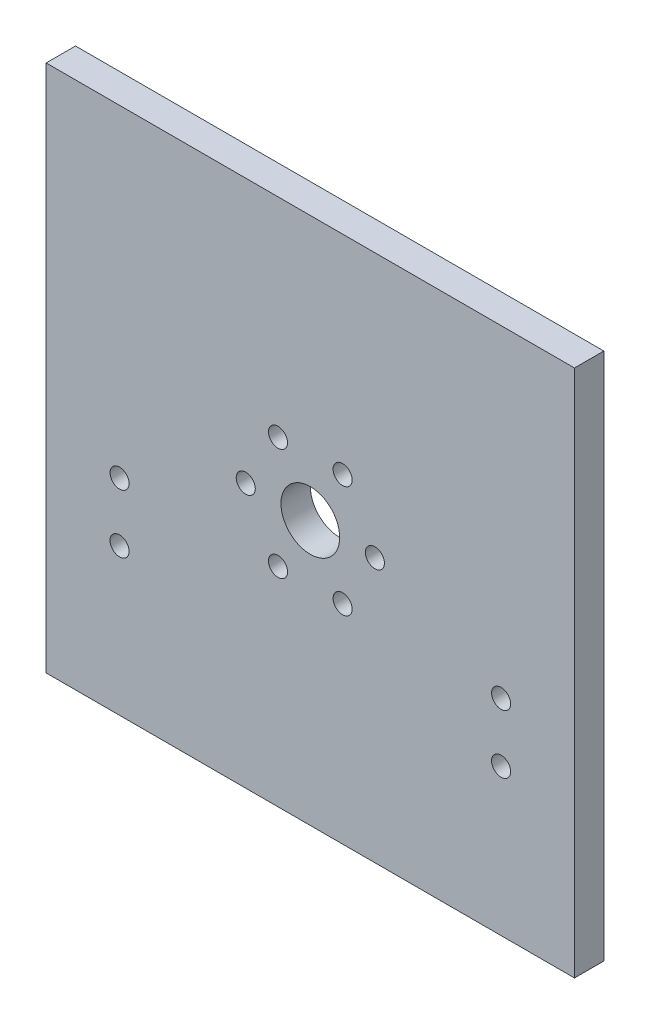
ISO-10303-21;
HEADER;
FILE_DESCRIPTION(('STEP AP214'),'2;1');
FILE_NAME('part.step','',(''),(''),'','','');
FILE_SCHEMA(('AUTOMOTIVE_DESIGN { 1 0 10303 214 1 1 1 1 }'));
ENDSEC;
DATA;
#1=APPLICATION_CONTEXT('core data for automotive mechanical design processes');
#2=APPLICATION_PROTOCOL_DEFINITION('international standard','automotive_design',2000,#1);
#3=PRODUCT_CONTEXT('',#1,'mechanical');
#4=PRODUCT('Part','Part','',(#3));
#5=PRODUCT_RELATED_PRODUCT_CATEGORY('part','',(#4));
#6=PRODUCT_DEFINITION_FORMATION('','',#4);
#7=PRODUCT_DEFINITION_CONTEXT('part definition',#1,'design');
#8=PRODUCT_DEFINITION('design','',#6,#7);
#9=PRODUCT_DEFINITION_SHAPE('','',#8);
#10=(LENGTH_UNIT() NAMED_UNIT(*) SI_UNIT(.MILLI.,.METRE.));
#11=(NAMED_UNIT(*) PLANE_ANGLE_UNIT() SI_UNIT($,.RADIAN.));
#12=(NAMED_UNIT(*) SI_UNIT($,.STERADIAN.) SOLID_ANGLE_UNIT());
#13=UNCERTAINTY_MEASURE_WITH_UNIT(LENGTH_MEASURE(1.E-05),#10,'distance_accuracy_value','');
#14=(GEOMETRIC_REPRESENTATION_CONTEXT(3) GLOBAL_UNCERTAINTY_ASSIGNED_CONTEXT((#13)) GLOBAL_UNIT_ASSIGNED_CONTEXT((#10,
#11,#12)) REPRESENTATION_CONTEXT('',''));
#15=CARTESIAN_POINT('',(0.,0.,0.));
#16=DIRECTION('',(0.,0.,1.));
#17=DIRECTION('',(1.,0.,0.));
#18=AXIS2_PLACEMENT_3D('',#15,#16,#17);
#19=CARTESIAN_POINT('',(-90.,90.,10.));
#20=DIRECTION('',(1.,0.,0.));
#21=DIRECTION('',(0.,0.,-1.));
#22=AXIS2_PLACEMENT_3D('',#19,#20,#21);
#23=PLANE('',#22);
#24=DIRECTION('',(0.,-1.,0.));
#25=VECTOR('',#24,1.);
#26=CARTESIAN_POINT('',(-90.,90.,0.));
#27=LINE('',#26,#25);
#28=CARTESIAN_POINT('',(-90.,90.,0.));
#29=VERTEX_POINT('',#28);
#30=CARTESIAN_POINT('',(-90.,-90.,0.));
#31=VERTEX_POINT('',#30);
#32=EDGE_CURVE('E115',#29,#31,#27,.T.);
#33=ORIENTED_EDGE('',*,*,#32,.T.);
#34=DIRECTION('',(0.,0.,-1.));
#35=VECTOR('',#34,1.);
#36=CARTESIAN_POINT('',(-90.,-90.,10.));
#37=LINE('',#36,#35);
#38=CARTESIAN_POINT('',(-90.,-90.,10.));
#39=VERTEX_POINT('',#38);
#40=EDGE_CURVE('E11',#39,#31,#37,.T.);
#41=ORIENTED_EDGE('',*,*,#40,.F.);
#42=DIRECTION('',(0.,-1.,0.));
#43=VECTOR('',#42,1.);
#44=CARTESIAN_POINT('',(-90.,90.,10.));
#45=LINE('',#44,#43);
#46=CARTESIAN_POINT('',(-90.,90.,10.));
#47=VERTEX_POINT('',#46);
#48=EDGE_CURVE('E99',#47,#39,#45,.T.);
#49=ORIENTED_EDGE('',*,*,#48,.F.);
#50=DIRECTION('',(0.,0.,-1.));
#51=VECTOR('',#50,1.);
#52=CARTESIAN_POINT('',(-90.,90.,10.));
#53=LINE('',#52,#51);
#54=EDGE_CURVE('E111',#47,#29,#53,.T.);
#55=ORIENTED_EDGE('',*,*,#54,.T.);
#56=EDGE_LOOP('',(#33,#41,#49,#55));
#57=FACE_BOUND('',#56,.T.);
#58=ADVANCED_FACE('F47',(#57),#23,.F.);
#59=CARTESIAN_POINT('',(-90.,-90.,10.));
#60=DIRECTION('',(0.,1.,0.));
#61=DIRECTION('',(0.,0.,1.));
#62=AXIS2_PLACEMENT_3D('',#59,#60,#61);
#63=PLANE('',#62);
#64=DIRECTION('',(1.,0.,0.));
#65=VECTOR('',#64,1.);
#66=CARTESIAN_POINT('',(-90.,-90.,0.));
#67=LINE('',#66,#65);
#68=CARTESIAN_POINT('',(90.,-90.,0.));
#69=VERTEX_POINT('',#68);
#70=EDGE_CURVE('E104',#31,#69,#67,.T.);
#71=ORIENTED_EDGE('',*,*,#70,.T.);
#72=DIRECTION('',(0.,0.,-1.));
#73=VECTOR('',#72,1.);
#74=CARTESIAN_POINT('',(90.,-90.,10.));
#75=LINE('',#74,#73);
#76=CARTESIAN_POINT('',(90.,-90.,10.));
#77=VERTEX_POINT('',#76);
#78=EDGE_CURVE('E56',#77,#69,#75,.T.);
#79=ORIENTED_EDGE('',*,*,#78,.F.);
#80=DIRECTION('',(1.,0.,0.));
#81=VECTOR('',#80,1.);
#82=CARTESIAN_POINT('',(-90.,-90.,10.));
#83=LINE('',#82,#81);
#84=EDGE_CURVE('E94',#39,#77,#83,.T.);
#85=ORIENTED_EDGE('',*,*,#84,.F.);
#86=ORIENTED_EDGE('',*,*,#40,.T.);
#87=EDGE_LOOP('',(#71,#79,#85,#86));
#88=FACE_BOUND('',#87,.T.);
#89=ADVANCED_FACE('F103',(#88),#63,.F.);
#90=CARTESIAN_POINT('',(90.,-90.,10.));
#91=DIRECTION('',(-1.,0.,0.));
#92=DIRECTION('',(0.,0.,1.));
#93=AXIS2_PLACEMENT_3D('',#90,#91,#92);
#94=PLANE('',#93);
#95=DIRECTION('',(0.,1.,0.));
#96=VECTOR('',#95,1.);
#97=CARTESIAN_POINT('',(90.,-90.,0.));
#98=LINE('',#97,#96);
#99=CARTESIAN_POINT('',(90.,90.,0.));
#100=VERTEX_POINT('',#99);
#101=EDGE_CURVE('E81',#69,#100,#98,.T.);
#102=ORIENTED_EDGE('',*,*,#101,.T.);
#103=DIRECTION('',(0.,0.,-1.));
#104=VECTOR('',#103,1.);
#105=CARTESIAN_POINT('',(90.,90.,10.));
#106=LINE('',#105,#104);
#107=CARTESIAN_POINT('',(90.,90.,10.));
#108=VERTEX_POINT('',#107);
#109=EDGE_CURVE('E106',#108,#100,#106,.T.);
#110=ORIENTED_EDGE('',*,*,#109,.F.);
#111=DIRECTION('',(0.,1.,0.));
#112=VECTOR('',#111,1.);
#113=CARTESIAN_POINT('',(90.,-90.,10.));
#114=LINE('',#113,#112);
#115=EDGE_CURVE('E97',#77,#108,#114,.T.);
#116=ORIENTED_EDGE('',*,*,#115,.F.);
#117=ORIENTED_EDGE('',*,*,#78,.T.);
#118=EDGE_LOOP('',(#102,#110,#116,#117));
#119=FACE_BOUND('',#118,.T.);
#120=ADVANCED_FACE('F107',(#119),#94,.F.);
#121=CARTESIAN_POINT('',(90.,90.,10.));
#122=DIRECTION('',(0.,-1.,0.));
#123=DIRECTION('',(0.,0.,-1.));
#124=AXIS2_PLACEMENT_3D('',#121,#122,#123);
#125=PLANE('',#124);
#126=DIRECTION('',(-1.,0.,0.));
#127=VECTOR('',#126,1.);
#128=CARTESIAN_POINT('',(90.,90.,0.));
#129=LINE('',#128,#127);
#130=EDGE_CURVE('E87',#100,#29,#129,.T.);
#131=ORIENTED_EDGE('',*,*,#130,.T.);
#132=ORIENTED_EDGE('',*,*,#54,.F.);
#133=DIRECTION('',(-1.,0.,0.));
#134=VECTOR('',#133,1.);
#135=CARTESIAN_POINT('',(90.,90.,10.));
#136=LINE('',#135,#134);
#137=EDGE_CURVE('E64',#108,#47,#136,.T.);
#138=ORIENTED_EDGE('',*,*,#137,.F.);
#139=ORIENTED_EDGE('',*,*,#109,.T.);
#140=EDGE_LOOP('',(#131,#132,#138,#139));
#141=FACE_BOUND('',#140,.T.);
#142=ADVANCED_FACE('F129',(#141),#125,.F.);
#143=CARTESIAN_POINT('',(0.,0.,10.));
#144=DIRECTION('',(0.,0.,1.));
#145=DIRECTION('',(1.,0.,0.));
#146=AXIS2_PLACEMENT_3D('',#143,#144,#145);
#147=PLANE('',#146);
#148=CARTESIAN_POINT('',(65.,-40.,10.));
#149=DIRECTION('',(0.,0.,1.));
#150=DIRECTION('',(1.,0.,0.));
#151=AXIS2_PLACEMENT_3D('',#148,#149,#150);
#152=CIRCLE('',#151,3.25);
#153=CARTESIAN_POINT('',(68.25,-40.,10.));
#154=VERTEX_POINT('',#153);
#155=EDGE_CURVE('E119',#154,#154,#152,.T.);
#156=ORIENTED_EDGE('',*,*,#155,.F.);
#157=EDGE_LOOP('',(#156));
#158=FACE_BOUND('',#157,.T.);
#159=CARTESIAN_POINT('',(65.,-20.,10.));
#160=DIRECTION('',(0.,0.,1.));
#161=DIRECTION('',(1.,0.,0.));
#162=AXIS2_PLACEMENT_3D('',#159,#160,#161);
#163=CIRCLE('',#162,3.25);
#164=CARTESIAN_POINT('',(68.25,-20.,10.));
#165=VERTEX_POINT('',#164);
#166=EDGE_CURVE('E139',#165,#165,#163,.T.);
#167=ORIENTED_EDGE('',*,*,#166,.F.);
#168=EDGE_LOOP('',(#167));
#169=FACE_BOUND('',#168,.T.);
#170=CARTESIAN_POINT('',(-65.,-40.,10.));
#171=DIRECTION('',(0.,0.,1.));
#172=DIRECTION('',(1.,0.,0.));
#173=AXIS2_PLACEMENT_3D('',#170,#171,#172);
#174=CIRCLE('',#173,3.25);
#175=CARTESIAN_POINT('',(-61.75,-40.,10.));
#176=VERTEX_POINT('',#175);
#177=EDGE_CURVE('E143',#176,#176,#174,.T.);
#178=ORIENTED_EDGE('',*,*,#177,.F.);
#179=EDGE_LOOP('',(#178));
#180=FACE_BOUND('',#179,.T.);
#181=CARTESIAN_POINT('',(-65.,-20.,10.));
#182=DIRECTION('',(0.,0.,1.));
#183=DIRECTION('',(1.,0.,0.));
#184=AXIS2_PLACEMENT_3D('',#181,#182,#183);
#185=CIRCLE('',#184,3.25);
#186=CARTESIAN_POINT('',(-61.75,-20.,10.));
#187=VERTEX_POINT('',#186);
#188=EDGE_CURVE('E147',#187,#187,#185,.T.);
#189=ORIENTED_EDGE('',*,*,#188,.F.);
#190=EDGE_LOOP('',(#189));
#191=FACE_BOUND('',#190,.T.);
#192=CARTESIAN_POINT('',(11.,-19.0525588832576,10.));
#193=DIRECTION('',(0.,0.,1.));
#194=DIRECTION('',(1.,0.,0.));
#195=AXIS2_PLACEMENT_3D('',#192,#193,#194);
#196=CIRCLE('',#195,3.25);
#197=CARTESIAN_POINT('',(14.25,-19.0525588832576,10.));
#198=VERTEX_POINT('',#197);
#199=EDGE_CURVE('E151',#198,#198,#196,.T.);
#200=ORIENTED_EDGE('',*,*,#199,.F.);
#201=EDGE_LOOP('',(#200));
#202=FACE_BOUND('',#201,.T.);
#203=CARTESIAN_POINT('',(-11.,-19.0525588832576,10.));
#204=DIRECTION('',(0.,0.,1.));
#205=DIRECTION('',(1.,0.,0.));
#206=AXIS2_PLACEMENT_3D('',#203,#204,#205);
#207=CIRCLE('',#206,3.25);
#208=CARTESIAN_POINT('',(-7.75000000000001,-19.0525588832576,10.));
#209=VERTEX_POINT('',#208);
#210=EDGE_CURVE('E155',#209,#209,#207,.T.);
#211=ORIENTED_EDGE('',*,*,#210,.F.);
#212=EDGE_LOOP('',(#211));
#213=FACE_BOUND('',#212,.T.);
#214=CARTESIAN_POINT('',(-22.,0.,10.));
#215=DIRECTION('',(0.,0.,1.));
#216=DIRECTION('',(1.,0.,0.));
#217=AXIS2_PLACEMENT_3D('',#214,#215,#216);
#218=CIRCLE('',#217,3.25);
#219=CARTESIAN_POINT('',(-18.75,0.,10.));
#220=VERTEX_POINT('',#219);
#221=EDGE_CURVE('E159',#220,#220,#218,.T.);
#222=ORIENTED_EDGE('',*,*,#221,.F.);
#223=EDGE_LOOP('',(#222));
#224=FACE_BOUND('',#223,.T.);
#225=CARTESIAN_POINT('',(-11.,19.0525588832577,10.));
#226=DIRECTION('',(0.,0.,1.));
#227=DIRECTION('',(1.,0.,0.));
#228=AXIS2_PLACEMENT_3D('',#225,#226,#227);
#229=CIRCLE('',#228,3.25);
#230=CARTESIAN_POINT('',(-7.74999999999999,19.0525588832577,10.));
#231=VERTEX_POINT('',#230);
#232=EDGE_CURVE('E163',#231,#231,#229,.T.);
#233=ORIENTED_EDGE('',*,*,#232,.F.);
#234=EDGE_LOOP('',(#233));
#235=FACE_BOUND('',#234,.T.);
#236=CARTESIAN_POINT('',(11.,19.0525588832576,10.));
#237=DIRECTION('',(0.,0.,1.));
#238=DIRECTION('',(1.,0.,0.));
#239=AXIS2_PLACEMENT_3D('',#236,#237,#238);
#240=CIRCLE('',#239,3.25);
#241=CARTESIAN_POINT('',(14.25,19.0525588832576,10.));
#242=VERTEX_POINT('',#241);
#243=EDGE_CURVE('E167',#242,#242,#240,.T.);
#244=ORIENTED_EDGE('',*,*,#243,.F.);
#245=EDGE_LOOP('',(#244));
#246=FACE_BOUND('',#245,.T.);
#247=CARTESIAN_POINT('',(22.,0.,10.));
#248=DIRECTION('',(0.,0.,1.));
#249=DIRECTION('',(1.,0.,0.));
#250=AXIS2_PLACEMENT_3D('',#247,#248,#249);
#251=CIRCLE('',#250,3.25);
#252=CARTESIAN_POINT('',(25.25,0.,10.));
#253=VERTEX_POINT('',#252);
#254=EDGE_CURVE('E171',#253,#253,#251,.T.);
#255=ORIENTED_EDGE('',*,*,#254,.F.);
#256=EDGE_LOOP('',(#255));
#257=FACE_BOUND('',#256,.T.);
#258=CARTESIAN_POINT('',(0.,0.,10.));
#259=DIRECTION('',(0.,0.,1.));
#260=DIRECTION('',(1.,0.,0.));
#261=AXIS2_PLACEMENT_3D('',#258,#259,#260);
#262=CIRCLE('',#261,10.);
#263=CARTESIAN_POINT('',(10.,0.,10.));
#264=VERTEX_POINT('',#263);
#265=EDGE_CURVE('E175',#264,#264,#262,.T.);
#266=ORIENTED_EDGE('',*,*,#265,.F.);
#267=EDGE_LOOP('',(#266));
#268=FACE_BOUND('',#267,.T.);
#269=ORIENTED_EDGE('',*,*,#48,.T.);
#270=ORIENTED_EDGE('',*,*,#84,.T.);
#271=ORIENTED_EDGE('',*,*,#115,.T.);
#272=ORIENTED_EDGE('',*,*,#137,.T.);
#273=EDGE_LOOP('',(#269,#270,#271,#272));
#274=FACE_BOUND('',#273,.T.);
#275=ADVANCED_FACE('F95',(#158,#169,#180,#191,#202,#213,#224,#235,#246,#257,#268,#274),#147,.T.);
#276=CARTESIAN_POINT('',(0.,0.,0.));
#277=DIRECTION('',(0.,0.,1.));
#278=DIRECTION('',(1.,0.,0.));
#279=AXIS2_PLACEMENT_3D('',#276,#277,#278);
#280=PLANE('',#279);
#281=CARTESIAN_POINT('',(65.,-40.,0.));
#282=DIRECTION('',(0.,0.,-1.));
#283=DIRECTION('',(-1.,0.,0.));
#284=AXIS2_PLACEMENT_3D('',#281,#282,#283);
#285=CIRCLE('',#284,3.25);
#286=CARTESIAN_POINT('',(61.75,-40.,0.));
#287=VERTEX_POINT('',#286);
#288=EDGE_CURVE('E184',#287,#287,#285,.T.);
#289=ORIENTED_EDGE('',*,*,#288,.F.);
#290=EDGE_LOOP('',(#289));
#291=FACE_BOUND('',#290,.T.);
#292=CARTESIAN_POINT('',(65.,-20.,0.));
#293=DIRECTION('',(0.,0.,-1.));
#294=DIRECTION('',(-1.,0.,0.));
#295=AXIS2_PLACEMENT_3D('',#292,#293,#294);
#296=CIRCLE('',#295,3.25);
#297=CARTESIAN_POINT('',(61.75,-20.,0.));
#298=VERTEX_POINT('',#297);
#299=EDGE_CURVE('E188',#298,#298,#296,.T.);
#300=ORIENTED_EDGE('',*,*,#299,.F.);
#301=EDGE_LOOP('',(#300));
#302=FACE_BOUND('',#301,.T.);
#303=CARTESIAN_POINT('',(-65.,-40.,0.));
#304=DIRECTION('',(0.,0.,-1.));
#305=DIRECTION('',(-1.,0.,0.));
#306=AXIS2_PLACEMENT_3D('',#303,#304,#305);
#307=CIRCLE('',#306,3.25);
#308=CARTESIAN_POINT('',(-68.25,-40.,0.));
#309=VERTEX_POINT('',#308);
#310=EDGE_CURVE('E192',#309,#309,#307,.T.);
#311=ORIENTED_EDGE('',*,*,#310,.F.);
#312=EDGE_LOOP('',(#311));
#313=FACE_BOUND('',#312,.T.);
#314=CARTESIAN_POINT('',(-65.,-20.,0.));
#315=DIRECTION('',(0.,0.,-1.));
#316=DIRECTION('',(-1.,0.,0.));
#317=AXIS2_PLACEMENT_3D('',#314,#315,#316);
#318=CIRCLE('',#317,3.25);
#319=CARTESIAN_POINT('',(-68.25,-20.,0.));
#320=VERTEX_POINT('',#319);
#321=EDGE_CURVE('E196',#320,#320,#318,.T.);
#322=ORIENTED_EDGE('',*,*,#321,.F.);
#323=EDGE_LOOP('',(#322));
#324=FACE_BOUND('',#323,.T.);
#325=CARTESIAN_POINT('',(11.,-19.0525588832576,0.));
#326=DIRECTION('',(0.,0.,-1.));
#327=DIRECTION('',(-1.,0.,0.));
#328=AXIS2_PLACEMENT_3D('',#325,#326,#327);
#329=CIRCLE('',#328,3.25);
#330=CARTESIAN_POINT('',(7.75,-19.0525588832576,0.));
#331=VERTEX_POINT('',#330);
#332=EDGE_CURVE('E200',#331,#331,#329,.T.);
#333=ORIENTED_EDGE('',*,*,#332,.F.);
#334=EDGE_LOOP('',(#333));
#335=FACE_BOUND('',#334,.T.);
#336=CARTESIAN_POINT('',(-11.,-19.0525588832576,0.));
#337=DIRECTION('',(0.,0.,-1.));
#338=DIRECTION('',(-1.,0.,0.));
#339=AXIS2_PLACEMENT_3D('',#336,#337,#338);
#340=CIRCLE('',#339,3.25);
#341=CARTESIAN_POINT('',(-14.25,-19.0525588832576,0.));
#342=VERTEX_POINT('',#341);
#343=EDGE_CURVE('E204',#342,#342,#340,.T.);
#344=ORIENTED_EDGE('',*,*,#343,.F.);
#345=EDGE_LOOP('',(#344));
#346=FACE_BOUND('',#345,.T.);
#347=CARTESIAN_POINT('',(-22.,0.,0.));
#348=DIRECTION('',(0.,0.,-1.));
#349=DIRECTION('',(-1.,0.,0.));
#350=AXIS2_PLACEMENT_3D('',#347,#348,#349);
#351=CIRCLE('',#350,3.25);
#352=CARTESIAN_POINT('',(-25.25,0.,0.));
#353=VERTEX_POINT('',#352);
#354=EDGE_CURVE('E208',#353,#353,#351,.T.);
#355=ORIENTED_EDGE('',*,*,#354,.F.);
#356=EDGE_LOOP('',(#355));
#357=FACE_BOUND('',#356,.T.);
#358=CARTESIAN_POINT('',(-11.,19.0525588832577,0.));
#359=DIRECTION('',(0.,0.,-1.));
#360=DIRECTION('',(-1.,0.,0.));
#361=AXIS2_PLACEMENT_3D('',#358,#359,#360);
#362=CIRCLE('',#361,3.25);
#363=CARTESIAN_POINT('',(-14.25,19.0525588832577,0.));
#364=VERTEX_POINT('',#363);
#365=EDGE_CURVE('E212',#364,#364,#362,.T.);
#366=ORIENTED_EDGE('',*,*,#365,.F.);
#367=EDGE_LOOP('',(#366));
#368=FACE_BOUND('',#367,.T.);
#369=CARTESIAN_POINT('',(11.,19.0525588832576,0.));
#370=DIRECTION('',(0.,0.,-1.));
#371=DIRECTION('',(-1.,0.,0.));
#372=AXIS2_PLACEMENT_3D('',#369,#370,#371);
#373=CIRCLE('',#372,3.25);
#374=CARTESIAN_POINT('',(7.75,19.0525588832576,0.));
#375=VERTEX_POINT('',#374);
#376=EDGE_CURVE('E216',#375,#375,#373,.T.);
#377=ORIENTED_EDGE('',*,*,#376,.F.);
#378=EDGE_LOOP('',(#377));
#379=FACE_BOUND('',#378,.T.);
#380=CARTESIAN_POINT('',(22.,0.,0.));
#381=DIRECTION('',(0.,0.,-1.));
#382=DIRECTION('',(-1.,0.,0.));
#383=AXIS2_PLACEMENT_3D('',#380,#381,#382);
#384=CIRCLE('',#383,3.25);
#385=CARTESIAN_POINT('',(18.75,0.,0.));
#386=VERTEX_POINT('',#385);
#387=EDGE_CURVE('E183',#386,#386,#384,.T.);
#388=ORIENTED_EDGE('',*,*,#387,.F.);
#389=EDGE_LOOP('',(#388));
#390=FACE_BOUND('',#389,.T.);
#391=CARTESIAN_POINT('',(0.,0.,0.));
#392=DIRECTION('',(0.,0.,-1.));
#393=DIRECTION('',(-1.,0.,0.));
#394=AXIS2_PLACEMENT_3D('',#391,#392,#393);
#395=CIRCLE('',#394,10.);
#396=CARTESIAN_POINT('',(-10.,0.,0.));
#397=VERTEX_POINT('',#396);
#398=EDGE_CURVE('E179',#397,#397,#395,.T.);
#399=ORIENTED_EDGE('',*,*,#398,.F.);
#400=EDGE_LOOP('',(#399));
#401=FACE_BOUND('',#400,.T.);
#402=ORIENTED_EDGE('',*,*,#32,.F.);
#403=ORIENTED_EDGE('',*,*,#130,.F.);
#404=ORIENTED_EDGE('',*,*,#101,.F.);
#405=ORIENTED_EDGE('',*,*,#70,.F.);
#406=EDGE_LOOP('',(#402,#403,#404,#405));
#407=FACE_BOUND('',#406,.T.);
#408=ADVANCED_FACE('F132',(#291,#302,#313,#324,#335,#346,#357,#368,#379,#390,#401,#407),#280,.F.);
#409=CARTESIAN_POINT('',(0.,0.,11.));
#410=DIRECTION('',(0.,0.,-1.));
#411=DIRECTION('',(-1.,0.,0.));
#412=AXIS2_PLACEMENT_3D('',#409,#410,#411);
#413=CYLINDRICAL_SURFACE('',#412,10.);
#414=ORIENTED_EDGE('',*,*,#265,.T.);
#415=EDGE_LOOP('',(#414));
#416=FACE_BOUND('',#415,.T.);
#417=ORIENTED_EDGE('',*,*,#398,.T.);
#418=EDGE_LOOP('',(#417));
#419=FACE_BOUND('',#418,.T.);
#420=ADVANCED_FACE('F228',(#416,#419),#413,.F.);
#421=CARTESIAN_POINT('',(22.,0.,11.));
#422=DIRECTION('',(0.,0.,-1.));
#423=DIRECTION('',(-1.,0.,0.));
#424=AXIS2_PLACEMENT_3D('',#421,#422,#423);
#425=CYLINDRICAL_SURFACE('',#424,3.25);
#426=ORIENTED_EDGE('',*,*,#254,.T.);
#427=EDGE_LOOP('',(#426));
#428=FACE_BOUND('',#427,.T.);
#429=ORIENTED_EDGE('',*,*,#387,.T.);
#430=EDGE_LOOP('',(#429));
#431=FACE_BOUND('',#430,.T.);
#432=ADVANCED_FACE('F224',(#428,#431),#425,.F.);
#433=CARTESIAN_POINT('',(11.,19.0525588832576,11.));
#434=DIRECTION('',(0.,0.,-1.));
#435=DIRECTION('',(-1.,0.,0.));
#436=AXIS2_PLACEMENT_3D('',#433,#434,#435);
#437=CYLINDRICAL_SURFACE('',#436,3.25);
#438=ORIENTED_EDGE('',*,*,#243,.T.);
#439=EDGE_LOOP('',(#438));
#440=FACE_BOUND('',#439,.T.);
#441=ORIENTED_EDGE('',*,*,#376,.T.);
#442=EDGE_LOOP('',(#441));
#443=FACE_BOUND('',#442,.T.);
#444=ADVANCED_FACE('F239',(#440,#443),#437,.F.);
#445=CARTESIAN_POINT('',(-11.,19.0525588832577,11.));
#446=DIRECTION('',(0.,0.,-1.));
#447=DIRECTION('',(-1.,0.,0.));
#448=AXIS2_PLACEMENT_3D('',#445,#446,#447);
#449=CYLINDRICAL_SURFACE('',#448,3.25);
#450=ORIENTED_EDGE('',*,*,#232,.T.);
#451=EDGE_LOOP('',(#450));
#452=FACE_BOUND('',#451,.T.);
#453=ORIENTED_EDGE('',*,*,#365,.T.);
#454=EDGE_LOOP('',(#453));
#455=FACE_BOUND('',#454,.T.);
#456=ADVANCED_FACE('F282',(#452,#455),#449,.F.);
#457=CARTESIAN_POINT('',(-22.,0.,11.));
#458=DIRECTION('',(0.,0.,-1.));
#459=DIRECTION('',(-1.,0.,0.));
#460=AXIS2_PLACEMENT_3D('',#457,#458,#459);
#461=CYLINDRICAL_SURFACE('',#460,3.25);
#462=ORIENTED_EDGE('',*,*,#221,.T.);
#463=EDGE_LOOP('',(#462));
#464=FACE_BOUND('',#463,.T.);
#465=ORIENTED_EDGE('',*,*,#354,.T.);
#466=EDGE_LOOP('',(#465));
#467=FACE_BOUND('',#466,.T.);
#468=ADVANCED_FACE('F289',(#464,#467),#461,.F.);
#469=CARTESIAN_POINT('',(-11.,-19.0525588832576,11.));
#470=DIRECTION('',(0.,0.,-1.));
#471=DIRECTION('',(-1.,0.,0.));
#472=AXIS2_PLACEMENT_3D('',#469,#470,#471);
#473=CYLINDRICAL_SURFACE('',#472,3.25);
#474=ORIENTED_EDGE('',*,*,#210,.T.);
#475=EDGE_LOOP('',(#474));
#476=FACE_BOUND('',#475,.T.);
#477=ORIENTED_EDGE('',*,*,#343,.T.);
#478=EDGE_LOOP('',(#477));
#479=FACE_BOUND('',#478,.T.);
#480=ADVANCED_FACE('F295',(#476,#479),#473,.F.);
#481=CARTESIAN_POINT('',(11.,-19.0525588832576,11.));
#482=DIRECTION('',(0.,0.,-1.));
#483=DIRECTION('',(-1.,0.,0.));
#484=AXIS2_PLACEMENT_3D('',#481,#482,#483);
#485=CYLINDRICAL_SURFACE('',#484,3.25);
#486=ORIENTED_EDGE('',*,*,#199,.T.);
#487=EDGE_LOOP('',(#486));
#488=FACE_BOUND('',#487,.T.);
#489=ORIENTED_EDGE('',*,*,#332,.T.);
#490=EDGE_LOOP('',(#489));
#491=FACE_BOUND('',#490,.T.);
#492=ADVANCED_FACE('F299',(#488,#491),#485,.F.);
#493=CARTESIAN_POINT('',(-65.,-20.,11.));
#494=DIRECTION('',(0.,0.,-1.));
#495=DIRECTION('',(-1.,0.,0.));
#496=AXIS2_PLACEMENT_3D('',#493,#494,#495);
#497=CYLINDRICAL_SURFACE('',#496,3.25);
#498=ORIENTED_EDGE('',*,*,#188,.T.);
#499=EDGE_LOOP('',(#498));
#500=FACE_BOUND('',#499,.T.);
#501=ORIENTED_EDGE('',*,*,#321,.T.);
#502=EDGE_LOOP('',(#501));
#503=FACE_BOUND('',#502,.T.);
#504=ADVANCED_FACE('F303',(#500,#503),#497,.F.);
#505=CARTESIAN_POINT('',(-65.,-40.,11.));
#506=DIRECTION('',(0.,0.,-1.));
#507=DIRECTION('',(-1.,0.,0.));
#508=AXIS2_PLACEMENT_3D('',#505,#506,#507);
#509=CYLINDRICAL_SURFACE('',#508,3.25);
#510=ORIENTED_EDGE('',*,*,#177,.T.);
#511=EDGE_LOOP('',(#510));
#512=FACE_BOUND('',#511,.T.);
#513=ORIENTED_EDGE('',*,*,#310,.T.);
#514=EDGE_LOOP('',(#513));
#515=FACE_BOUND('',#514,.T.);
#516=ADVANCED_FACE('F307',(#512,#515),#509,.F.);
#517=CARTESIAN_POINT('',(65.,-20.,11.));
#518=DIRECTION('',(0.,0.,-1.));
#519=DIRECTION('',(-1.,0.,0.));
#520=AXIS2_PLACEMENT_3D('',#517,#518,#519);
#521=CYLINDRICAL_SURFACE('',#520,3.25);
#522=ORIENTED_EDGE('',*,*,#166,.T.);
#523=EDGE_LOOP('',(#522));
#524=FACE_BOUND('',#523,.T.);
#525=ORIENTED_EDGE('',*,*,#299,.T.);
#526=EDGE_LOOP('',(#525));
#527=FACE_BOUND('',#526,.T.);
#528=ADVANCED_FACE('F311',(#524,#527),#521,.F.);
#529=CARTESIAN_POINT('',(65.,-40.,11.));
#530=DIRECTION('',(0.,0.,-1.));
#531=DIRECTION('',(-1.,0.,0.));
#532=AXIS2_PLACEMENT_3D('',#529,#530,#531);
#533=CYLINDRICAL_SURFACE('',#532,3.25);
#534=ORIENTED_EDGE('',*,*,#155,.T.);
#535=EDGE_LOOP('',(#534));
#536=FACE_BOUND('',#535,.T.);
#537=ORIENTED_EDGE('',*,*,#288,.T.);
#538=EDGE_LOOP('',(#537));
#539=FACE_BOUND('',#538,.T.);
#540=ADVANCED_FACE('F314',(#536,#539),#533,.F.);
#541=CLOSED_SHELL('',(#58,#89,#120,#142,#275,#408,#420,#432,#444,#456,#468,#480,#492,#504,#516,
#528,#540));
#542=MANIFOLD_SOLID_BREP('B2',#541);
#543=ADVANCED_BREP_SHAPE_REPRESENTATION('',(#18,#542),#14);
#544=SHAPE_DEFINITION_REPRESENTATION(#9,#543);
ENDSEC;
END-ISO-10303-21;
